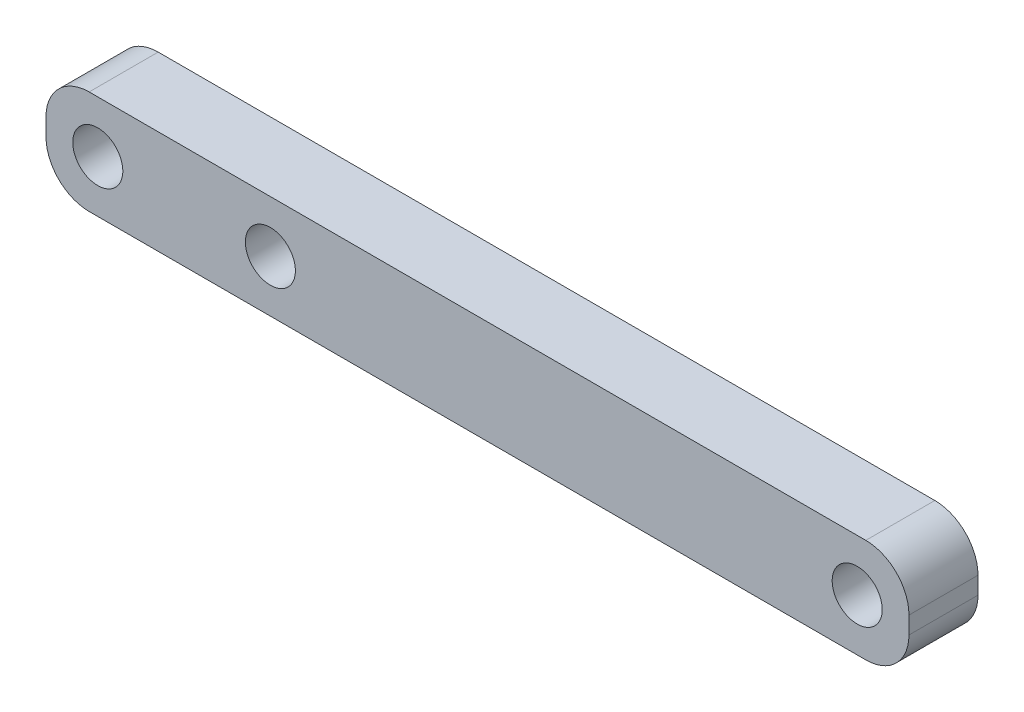
ISO-10303-21;
HEADER;
FILE_DESCRIPTION(('STEP AP214'),'2;1');
FILE_NAME('part.step','',(''),(''),'','','');
FILE_SCHEMA(('AUTOMOTIVE_DESIGN { 1 0 10303 214 1 1 1 1 }'));
ENDSEC;
DATA;
#1=APPLICATION_CONTEXT('core data for automotive mechanical design processes');
#2=APPLICATION_PROTOCOL_DEFINITION('international standard','automotive_design',2000,#1);
#3=PRODUCT_CONTEXT('',#1,'mechanical');
#4=PRODUCT('Part','Part','',(#3));
#5=PRODUCT_RELATED_PRODUCT_CATEGORY('part','',(#4));
#6=PRODUCT_DEFINITION_FORMATION('','',#4);
#7=PRODUCT_DEFINITION_CONTEXT('part definition',#1,'design');
#8=PRODUCT_DEFINITION('design','',#6,#7);
#9=PRODUCT_DEFINITION_SHAPE('','',#8);
#10=(LENGTH_UNIT() NAMED_UNIT(*) SI_UNIT(.MILLI.,.METRE.));
#11=(NAMED_UNIT(*) PLANE_ANGLE_UNIT() SI_UNIT($,.RADIAN.));
#12=(NAMED_UNIT(*) SI_UNIT($,.STERADIAN.) SOLID_ANGLE_UNIT());
#13=UNCERTAINTY_MEASURE_WITH_UNIT(LENGTH_MEASURE(1.E-05),#10,'distance_accuracy_value','');
#14=(GEOMETRIC_REPRESENTATION_CONTEXT(3) GLOBAL_UNCERTAINTY_ASSIGNED_CONTEXT((#13)) GLOBAL_UNIT_ASSIGNED_CONTEXT((#10,
#11,#12)) REPRESENTATION_CONTEXT('',''));
#15=CARTESIAN_POINT('',(0.,0.,0.));
#16=DIRECTION('',(0.,0.,1.));
#17=DIRECTION('',(1.,0.,0.));
#18=AXIS2_PLACEMENT_3D('',#15,#16,#17);
#19=CARTESIAN_POINT('',(0.,0.,4.));
#20=DIRECTION('',(-1.,0.,0.));
#21=DIRECTION('',(0.,0.,1.));
#22=AXIS2_PLACEMENT_3D('',#19,#20,#21);
#23=PLANE('',#22);
#24=DIRECTION('',(0.,1.,0.));
#25=VECTOR('',#24,1.);
#26=CARTESIAN_POINT('',(0.,0.,4.));
#27=LINE('',#26,#25);
#28=CARTESIAN_POINT('',(0.,-3.5,4.));
#29=VERTEX_POINT('',#28);
#30=CARTESIAN_POINT('',(0.,-2.5,4.));
#31=VERTEX_POINT('',#30);
#32=EDGE_CURVE('E138',#29,#31,#27,.T.);
#33=ORIENTED_EDGE('',*,*,#32,.F.);
#34=DIRECTION('',(0.,0.,-1.));
#35=VECTOR('',#34,1.);
#36=CARTESIAN_POINT('',(0.,-3.5,4.));
#37=LINE('',#36,#35);
#38=CARTESIAN_POINT('',(0.,-3.5,0.));
#39=VERTEX_POINT('',#38);
#40=EDGE_CURVE('E13',#29,#39,#37,.T.);
#41=ORIENTED_EDGE('',*,*,#40,.T.);
#42=DIRECTION('',(0.,1.,0.));
#43=VECTOR('',#42,1.);
#44=CARTESIAN_POINT('',(0.,0.,0.));
#45=LINE('',#44,#43);
#46=CARTESIAN_POINT('',(0.,-2.5,0.));
#47=VERTEX_POINT('',#46);
#48=EDGE_CURVE('E169',#39,#47,#45,.T.);
#49=ORIENTED_EDGE('',*,*,#48,.T.);
#50=DIRECTION('',(0.,0.,-1.));
#51=VECTOR('',#50,1.);
#52=CARTESIAN_POINT('',(0.,-2.5,4.));
#53=LINE('',#52,#51);
#54=EDGE_CURVE('E52',#47,#31,#53,.F.);
#55=ORIENTED_EDGE('',*,*,#54,.T.);
#56=EDGE_LOOP('',(#33,#41,#49,#55));
#57=FACE_BOUND('',#56,.T.);
#58=ADVANCED_FACE('F44',(#57),#23,.F.);
#59=CARTESIAN_POINT('',(0.,0.,4.));
#60=DIRECTION('',(0.,-1.,0.));
#61=DIRECTION('',(1.,0.,0.));
#62=AXIS2_PLACEMENT_3D('',#59,#60,#61);
#63=PLANE('',#62);
#64=DIRECTION('',(-1.,0.,0.));
#65=VECTOR('',#64,1.);
#66=CARTESIAN_POINT('',(0.,0.,0.));
#67=LINE('',#66,#65);
#68=CARTESIAN_POINT('',(-2.5,0.,0.));
#69=VERTEX_POINT('',#68);
#70=CARTESIAN_POINT('',(-47.5,0.,0.));
#71=VERTEX_POINT('',#70);
#72=EDGE_CURVE('E143',#69,#71,#67,.T.);
#73=ORIENTED_EDGE('',*,*,#72,.T.);
#74=DIRECTION('',(0.,0.,-1.));
#75=VECTOR('',#74,1.);
#76=CARTESIAN_POINT('',(-47.5,0.,4.));
#77=LINE('',#76,#75);
#78=CARTESIAN_POINT('',(-47.5,0.,4.));
#79=VERTEX_POINT('',#78);
#80=EDGE_CURVE('E59',#71,#79,#77,.F.);
#81=ORIENTED_EDGE('',*,*,#80,.T.);
#82=DIRECTION('',(-1.,0.,0.));
#83=VECTOR('',#82,1.);
#84=CARTESIAN_POINT('',(0.,0.,4.));
#85=LINE('',#84,#83);
#86=CARTESIAN_POINT('',(-2.5,0.,4.));
#87=VERTEX_POINT('',#86);
#88=EDGE_CURVE('E141',#87,#79,#85,.T.);
#89=ORIENTED_EDGE('',*,*,#88,.F.);
#90=DIRECTION('',(0.,0.,-1.));
#91=VECTOR('',#90,1.);
#92=CARTESIAN_POINT('',(-2.5,0.,4.));
#93=LINE('',#92,#91);
#94=EDGE_CURVE('E161',#87,#69,#93,.T.);
#95=ORIENTED_EDGE('',*,*,#94,.T.);
#96=EDGE_LOOP('',(#73,#81,#89,#95));
#97=FACE_BOUND('',#96,.T.);
#98=ADVANCED_FACE('F176',(#97),#63,.F.);
#99=CARTESIAN_POINT('',(-50.,0.,4.));
#100=DIRECTION('',(1.,0.,0.));
#101=DIRECTION('',(0.,0.,-1.));
#102=AXIS2_PLACEMENT_3D('',#99,#100,#101);
#103=PLANE('',#102);
#104=DIRECTION('',(0.,-1.,0.));
#105=VECTOR('',#104,1.);
#106=CARTESIAN_POINT('',(-50.,0.,0.));
#107=LINE('',#106,#105);
#108=CARTESIAN_POINT('',(-50.,-2.50000000000001,0.));
#109=VERTEX_POINT('',#108);
#110=CARTESIAN_POINT('',(-50.,-3.50000000000001,0.));
#111=VERTEX_POINT('',#110);
#112=EDGE_CURVE('E139',#109,#111,#107,.T.);
#113=ORIENTED_EDGE('',*,*,#112,.T.);
#114=DIRECTION('',(0.,0.,-1.));
#115=VECTOR('',#114,1.);
#116=CARTESIAN_POINT('',(-50.,-3.50000000000001,4.));
#117=LINE('',#116,#115);
#118=CARTESIAN_POINT('',(-50.,-3.50000000000001,4.));
#119=VERTEX_POINT('',#118);
#120=EDGE_CURVE('E116',#111,#119,#117,.F.);
#121=ORIENTED_EDGE('',*,*,#120,.T.);
#122=DIRECTION('',(0.,-1.,0.));
#123=VECTOR('',#122,1.);
#124=CARTESIAN_POINT('',(-50.,0.,4.));
#125=LINE('',#124,#123);
#126=CARTESIAN_POINT('',(-50.,-2.50000000000001,4.));
#127=VERTEX_POINT('',#126);
#128=EDGE_CURVE('E181',#127,#119,#125,.T.);
#129=ORIENTED_EDGE('',*,*,#128,.F.);
#130=DIRECTION('',(0.,0.,-1.));
#131=VECTOR('',#130,1.);
#132=CARTESIAN_POINT('',(-50.,-2.50000000000001,4.));
#133=LINE('',#132,#131);
#134=EDGE_CURVE('E121',#127,#109,#133,.T.);
#135=ORIENTED_EDGE('',*,*,#134,.T.);
#136=EDGE_LOOP('',(#113,#121,#129,#135));
#137=FACE_BOUND('',#136,.T.);
#138=ADVANCED_FACE('F234',(#137),#103,.F.);
#139=CARTESIAN_POINT('',(0.,-6.,4.));
#140=DIRECTION('',(0.,1.,0.));
#141=DIRECTION('',(-1.,0.,0.));
#142=AXIS2_PLACEMENT_3D('',#139,#140,#141);
#143=PLANE('',#142);
#144=DIRECTION('',(1.,0.,0.));
#145=VECTOR('',#144,1.);
#146=CARTESIAN_POINT('',(0.,-6.,4.));
#147=LINE('',#146,#145);
#148=CARTESIAN_POINT('',(-47.5,-6.00000000000001,4.));
#149=VERTEX_POINT('',#148);
#150=CARTESIAN_POINT('',(-2.5,-6.,4.));
#151=VERTEX_POINT('',#150);
#152=EDGE_CURVE('E131',#149,#151,#147,.T.);
#153=ORIENTED_EDGE('',*,*,#152,.F.);
#154=DIRECTION('',(0.,0.,-1.));
#155=VECTOR('',#154,1.);
#156=CARTESIAN_POINT('',(-47.5,-6.00000000000001,4.));
#157=LINE('',#156,#155);
#158=CARTESIAN_POINT('',(-47.5,-6.00000000000001,0.));
#159=VERTEX_POINT('',#158);
#160=EDGE_CURVE('E115',#149,#159,#157,.T.);
#161=ORIENTED_EDGE('',*,*,#160,.T.);
#162=DIRECTION('',(1.,0.,0.));
#163=VECTOR('',#162,1.);
#164=CARTESIAN_POINT('',(0.,-6.,0.));
#165=LINE('',#164,#163);
#166=CARTESIAN_POINT('',(-2.5,-6.,0.));
#167=VERTEX_POINT('',#166);
#168=EDGE_CURVE('E128',#159,#167,#165,.T.);
#169=ORIENTED_EDGE('',*,*,#168,.T.);
#170=DIRECTION('',(0.,0.,-1.));
#171=VECTOR('',#170,1.);
#172=CARTESIAN_POINT('',(-2.5,-6.,4.));
#173=LINE('',#172,#171);
#174=EDGE_CURVE('E133',#167,#151,#173,.F.);
#175=ORIENTED_EDGE('',*,*,#174,.T.);
#176=EDGE_LOOP('',(#153,#161,#169,#175));
#177=FACE_BOUND('',#176,.T.);
#178=ADVANCED_FACE('F127',(#177),#143,.F.);
#179=CARTESIAN_POINT('',(0.,0.,4.));
#180=DIRECTION('',(0.,0.,-1.));
#181=DIRECTION('',(-1.,0.,0.));
#182=AXIS2_PLACEMENT_3D('',#179,#180,#181);
#183=PLANE('',#182);
#184=CARTESIAN_POINT('',(-47.,-3.,4.));
#185=DIRECTION('',(0.,0.,-1.));
#186=DIRECTION('',(-1.,0.,0.));
#187=AXIS2_PLACEMENT_3D('',#184,#185,#186);
#188=CIRCLE('',#187,1.45);
#189=CARTESIAN_POINT('',(-48.45,-3.,4.));
#190=VERTEX_POINT('',#189);
#191=EDGE_CURVE('E193',#190,#190,#188,.T.);
#192=ORIENTED_EDGE('',*,*,#191,.T.);
#193=EDGE_LOOP('',(#192));
#194=FACE_BOUND('',#193,.T.);
#195=CARTESIAN_POINT('',(-37.,-3.00000000000001,4.));
#196=DIRECTION('',(0.,0.,-1.));
#197=DIRECTION('',(-1.,0.,0.));
#198=AXIS2_PLACEMENT_3D('',#195,#196,#197);
#199=CIRCLE('',#198,1.45);
#200=CARTESIAN_POINT('',(-38.45,-3.00000000000001,4.));
#201=VERTEX_POINT('',#200);
#202=EDGE_CURVE('E187',#201,#201,#199,.T.);
#203=ORIENTED_EDGE('',*,*,#202,.T.);
#204=EDGE_LOOP('',(#203));
#205=FACE_BOUND('',#204,.T.);
#206=CARTESIAN_POINT('',(-3.,-3.,4.));
#207=DIRECTION('',(0.,0.,-1.));
#208=DIRECTION('',(-1.,0.,0.));
#209=AXIS2_PLACEMENT_3D('',#206,#207,#208);
#210=CIRCLE('',#209,1.45);
#211=CARTESIAN_POINT('',(-4.45,-3.,4.));
#212=VERTEX_POINT('',#211);
#213=EDGE_CURVE('E177',#212,#212,#210,.T.);
#214=ORIENTED_EDGE('',*,*,#213,.T.);
#215=EDGE_LOOP('',(#214));
#216=FACE_BOUND('',#215,.T.);
#217=ORIENTED_EDGE('',*,*,#128,.T.);
#218=CARTESIAN_POINT('',(-47.5,-3.50000000000001,4.));
#219=DIRECTION('',(0.,0.,-1.));
#220=DIRECTION('',(-1.,0.,0.));
#221=AXIS2_PLACEMENT_3D('',#218,#219,#220);
#222=CIRCLE('',#221,2.5);
#223=EDGE_CURVE('E159',#119,#149,#222,.F.);
#224=ORIENTED_EDGE('',*,*,#223,.T.);
#225=ORIENTED_EDGE('',*,*,#152,.T.);
#226=CARTESIAN_POINT('',(-2.5,-3.5,4.));
#227=DIRECTION('',(0.,0.,-1.));
#228=DIRECTION('',(-1.,0.,0.));
#229=AXIS2_PLACEMENT_3D('',#226,#227,#228);
#230=CIRCLE('',#229,2.5);
#231=EDGE_CURVE('E155',#151,#29,#230,.F.);
#232=ORIENTED_EDGE('',*,*,#231,.T.);
#233=ORIENTED_EDGE('',*,*,#32,.T.);
#234=CARTESIAN_POINT('',(-2.5,-2.5,4.));
#235=DIRECTION('',(0.,0.,-1.));
#236=DIRECTION('',(-1.,0.,0.));
#237=AXIS2_PLACEMENT_3D('',#234,#235,#236);
#238=CIRCLE('',#237,2.5);
#239=EDGE_CURVE('E66',#31,#87,#238,.F.);
#240=ORIENTED_EDGE('',*,*,#239,.T.);
#241=ORIENTED_EDGE('',*,*,#88,.T.);
#242=CARTESIAN_POINT('',(-47.5,-2.50000000000001,4.));
#243=DIRECTION('',(0.,0.,-1.));
#244=DIRECTION('',(-1.,0.,0.));
#245=AXIS2_PLACEMENT_3D('',#242,#243,#244);
#246=CIRCLE('',#245,2.5);
#247=EDGE_CURVE('E157',#79,#127,#246,.F.);
#248=ORIENTED_EDGE('',*,*,#247,.T.);
#249=EDGE_LOOP('',(#217,#224,#225,#232,#233,#240,#241,#248));
#250=FACE_BOUND('',#249,.T.);
#251=ADVANCED_FACE('F172',(#194,#205,#216,#250),#183,.F.);
#252=CARTESIAN_POINT('',(0.,0.,0.));
#253=DIRECTION('',(0.,0.,-1.));
#254=DIRECTION('',(-1.,0.,0.));
#255=AXIS2_PLACEMENT_3D('',#252,#253,#254);
#256=PLANE('',#255);
#257=CARTESIAN_POINT('',(-47.,-3.,0.));
#258=DIRECTION('',(0.,0.,-1.));
#259=DIRECTION('',(-1.,0.,0.));
#260=AXIS2_PLACEMENT_3D('',#257,#258,#259);
#261=CIRCLE('',#260,1.45);
#262=CARTESIAN_POINT('',(-48.45,-3.,0.));
#263=VERTEX_POINT('',#262);
#264=EDGE_CURVE('E196',#263,#263,#261,.T.);
#265=ORIENTED_EDGE('',*,*,#264,.F.);
#266=EDGE_LOOP('',(#265));
#267=FACE_BOUND('',#266,.T.);
#268=CARTESIAN_POINT('',(-37.,-3.00000000000001,0.));
#269=DIRECTION('',(0.,0.,-1.));
#270=DIRECTION('',(-1.,0.,0.));
#271=AXIS2_PLACEMENT_3D('',#268,#269,#270);
#272=CIRCLE('',#271,1.45);
#273=CARTESIAN_POINT('',(-38.45,-3.00000000000001,0.));
#274=VERTEX_POINT('',#273);
#275=EDGE_CURVE('E190',#274,#274,#272,.T.);
#276=ORIENTED_EDGE('',*,*,#275,.F.);
#277=EDGE_LOOP('',(#276));
#278=FACE_BOUND('',#277,.T.);
#279=CARTESIAN_POINT('',(-3.,-3.,0.));
#280=DIRECTION('',(0.,0.,-1.));
#281=DIRECTION('',(-1.,0.,0.));
#282=AXIS2_PLACEMENT_3D('',#279,#280,#281);
#283=CIRCLE('',#282,1.45);
#284=CARTESIAN_POINT('',(-4.45,-3.,0.));
#285=VERTEX_POINT('',#284);
#286=EDGE_CURVE('E184',#285,#285,#283,.T.);
#287=ORIENTED_EDGE('',*,*,#286,.F.);
#288=EDGE_LOOP('',(#287));
#289=FACE_BOUND('',#288,.T.);
#290=ORIENTED_EDGE('',*,*,#168,.F.);
#291=CARTESIAN_POINT('',(-47.5,-3.50000000000001,0.));
#292=DIRECTION('',(0.,0.,-1.));
#293=DIRECTION('',(-1.,0.,0.));
#294=AXIS2_PLACEMENT_3D('',#291,#292,#293);
#295=CIRCLE('',#294,2.5);
#296=EDGE_CURVE('E111',#159,#111,#295,.T.);
#297=ORIENTED_EDGE('',*,*,#296,.T.);
#298=ORIENTED_EDGE('',*,*,#112,.F.);
#299=CARTESIAN_POINT('',(-47.5,-2.50000000000001,0.));
#300=DIRECTION('',(0.,0.,-1.));
#301=DIRECTION('',(-1.,0.,0.));
#302=AXIS2_PLACEMENT_3D('',#299,#300,#301);
#303=CIRCLE('',#302,2.5);
#304=EDGE_CURVE('E122',#109,#71,#303,.T.);
#305=ORIENTED_EDGE('',*,*,#304,.T.);
#306=ORIENTED_EDGE('',*,*,#72,.F.);
#307=CARTESIAN_POINT('',(-2.5,-2.5,0.));
#308=DIRECTION('',(0.,0.,-1.));
#309=DIRECTION('',(-1.,0.,0.));
#310=AXIS2_PLACEMENT_3D('',#307,#308,#309);
#311=CIRCLE('',#310,2.5);
#312=EDGE_CURVE('E132',#69,#47,#311,.T.);
#313=ORIENTED_EDGE('',*,*,#312,.T.);
#314=ORIENTED_EDGE('',*,*,#48,.F.);
#315=CARTESIAN_POINT('',(-2.5,-3.5,0.));
#316=DIRECTION('',(0.,0.,-1.));
#317=DIRECTION('',(-1.,0.,0.));
#318=AXIS2_PLACEMENT_3D('',#315,#316,#317);
#319=CIRCLE('',#318,2.5);
#320=EDGE_CURVE('E137',#39,#167,#319,.T.);
#321=ORIENTED_EDGE('',*,*,#320,.T.);
#322=EDGE_LOOP('',(#290,#297,#298,#305,#306,#313,#314,#321));
#323=FACE_BOUND('',#322,.T.);
#324=ADVANCED_FACE('F135',(#267,#278,#289,#323),#256,.T.);
#325=CARTESIAN_POINT('',(-3.,-3.,4.));
#326=DIRECTION('',(0.,0.,-1.));
#327=DIRECTION('',(-1.,0.,0.));
#328=AXIS2_PLACEMENT_3D('',#325,#326,#327);
#329=CYLINDRICAL_SURFACE('',#328,1.45);
#330=ORIENTED_EDGE('',*,*,#213,.F.);
#331=EDGE_LOOP('',(#330));
#332=FACE_BOUND('',#331,.T.);
#333=ORIENTED_EDGE('',*,*,#286,.T.);
#334=EDGE_LOOP('',(#333));
#335=FACE_BOUND('',#334,.T.);
#336=ADVANCED_FACE('F212',(#332,#335),#329,.F.);
#337=CARTESIAN_POINT('',(-37.,-3.00000000000001,4.));
#338=DIRECTION('',(0.,0.,-1.));
#339=DIRECTION('',(-1.,0.,0.));
#340=AXIS2_PLACEMENT_3D('',#337,#338,#339);
#341=CYLINDRICAL_SURFACE('',#340,1.45);
#342=ORIENTED_EDGE('',*,*,#202,.F.);
#343=EDGE_LOOP('',(#342));
#344=FACE_BOUND('',#343,.T.);
#345=ORIENTED_EDGE('',*,*,#275,.T.);
#346=EDGE_LOOP('',(#345));
#347=FACE_BOUND('',#346,.T.);
#348=ADVANCED_FACE('F219',(#344,#347),#341,.F.);
#349=CARTESIAN_POINT('',(-47.5,-3.50000000000001,4.));
#350=DIRECTION('',(0.,0.,-1.));
#351=DIRECTION('',(-1.,0.,0.));
#352=AXIS2_PLACEMENT_3D('',#349,#350,#351);
#353=CYLINDRICAL_SURFACE('',#352,2.5);
#354=ORIENTED_EDGE('',*,*,#223,.F.);
#355=ORIENTED_EDGE('',*,*,#120,.F.);
#356=ORIENTED_EDGE('',*,*,#296,.F.);
#357=ORIENTED_EDGE('',*,*,#160,.F.);
#358=EDGE_LOOP('',(#354,#355,#356,#357));
#359=FACE_BOUND('',#358,.T.);
#360=ADVANCED_FACE('F114',(#359),#353,.T.);
#361=CARTESIAN_POINT('',(-47.5,-2.50000000000001,4.));
#362=DIRECTION('',(0.,0.,-1.));
#363=DIRECTION('',(-1.,0.,0.));
#364=AXIS2_PLACEMENT_3D('',#361,#362,#363);
#365=CYLINDRICAL_SURFACE('',#364,2.5);
#366=ORIENTED_EDGE('',*,*,#247,.F.);
#367=ORIENTED_EDGE('',*,*,#80,.F.);
#368=ORIENTED_EDGE('',*,*,#304,.F.);
#369=ORIENTED_EDGE('',*,*,#134,.F.);
#370=EDGE_LOOP('',(#366,#367,#368,#369));
#371=FACE_BOUND('',#370,.T.);
#372=ADVANCED_FACE('F240',(#371),#365,.T.);
#373=CARTESIAN_POINT('',(-2.5,-3.5,4.));
#374=DIRECTION('',(0.,0.,-1.));
#375=DIRECTION('',(-1.,0.,0.));
#376=AXIS2_PLACEMENT_3D('',#373,#374,#375);
#377=CYLINDRICAL_SURFACE('',#376,2.5);
#378=ORIENTED_EDGE('',*,*,#231,.F.);
#379=ORIENTED_EDGE('',*,*,#174,.F.);
#380=ORIENTED_EDGE('',*,*,#320,.F.);
#381=ORIENTED_EDGE('',*,*,#40,.F.);
#382=EDGE_LOOP('',(#378,#379,#380,#381));
#383=FACE_BOUND('',#382,.T.);
#384=ADVANCED_FACE('F242',(#383),#377,.T.);
#385=CARTESIAN_POINT('',(-2.5,-2.5,4.));
#386=DIRECTION('',(0.,0.,-1.));
#387=DIRECTION('',(-1.,0.,0.));
#388=AXIS2_PLACEMENT_3D('',#385,#386,#387);
#389=CYLINDRICAL_SURFACE('',#388,2.5);
#390=ORIENTED_EDGE('',*,*,#239,.F.);
#391=ORIENTED_EDGE('',*,*,#54,.F.);
#392=ORIENTED_EDGE('',*,*,#312,.F.);
#393=ORIENTED_EDGE('',*,*,#94,.F.);
#394=EDGE_LOOP('',(#390,#391,#392,#393));
#395=FACE_BOUND('',#394,.T.);
#396=ADVANCED_FACE('F46',(#395),#389,.T.);
#397=CARTESIAN_POINT('',(-47.,-3.,4.));
#398=DIRECTION('',(0.,0.,-1.));
#399=DIRECTION('',(-1.,0.,0.));
#400=AXIS2_PLACEMENT_3D('',#397,#398,#399);
#401=CYLINDRICAL_SURFACE('',#400,1.45);
#402=ORIENTED_EDGE('',*,*,#191,.F.);
#403=EDGE_LOOP('',(#402));
#404=FACE_BOUND('',#403,.T.);
#405=ORIENTED_EDGE('',*,*,#264,.T.);
#406=EDGE_LOOP('',(#405));
#407=FACE_BOUND('',#406,.T.);
#408=ADVANCED_FACE('F204',(#404,#407),#401,.F.);
#409=CLOSED_SHELL('',(#58,#98,#138,#178,#251,#324,#336,#348,#360,#372,#384,#396,#408));
#410=MANIFOLD_SOLID_BREP('B2',#409);
#411=ADVANCED_BREP_SHAPE_REPRESENTATION('',(#18,#410),#14);
#412=SHAPE_DEFINITION_REPRESENTATION(#9,#411);
ENDSEC;
END-ISO-10303-21;
